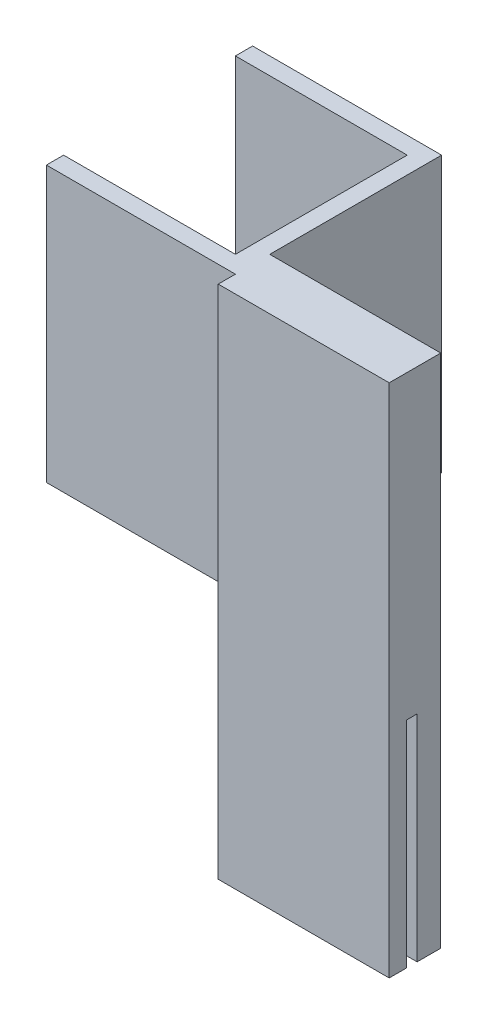
ISO-10303-21;
HEADER;
FILE_DESCRIPTION(('STEP AP214'),'2;1');
FILE_NAME('part.step','',(''),(''),'','','');
FILE_SCHEMA(('AUTOMOTIVE_DESIGN { 1 0 10303 214 1 1 1 1 }'));
ENDSEC;
DATA;
#1=APPLICATION_CONTEXT('core data for automotive mechanical design processes');
#2=APPLICATION_PROTOCOL_DEFINITION('international standard','automotive_design',2000,#1);
#3=PRODUCT_CONTEXT('',#1,'mechanical');
#4=PRODUCT('Part','Part','',(#3));
#5=PRODUCT_RELATED_PRODUCT_CATEGORY('part','',(#4));
#6=PRODUCT_DEFINITION_FORMATION('','',#4);
#7=PRODUCT_DEFINITION_CONTEXT('part definition',#1,'design');
#8=PRODUCT_DEFINITION('design','',#6,#7);
#9=PRODUCT_DEFINITION_SHAPE('','',#8);
#10=(LENGTH_UNIT() NAMED_UNIT(*) SI_UNIT(.MILLI.,.METRE.));
#11=(NAMED_UNIT(*) PLANE_ANGLE_UNIT() SI_UNIT($,.RADIAN.));
#12=(NAMED_UNIT(*) SI_UNIT($,.STERADIAN.) SOLID_ANGLE_UNIT());
#13=UNCERTAINTY_MEASURE_WITH_UNIT(LENGTH_MEASURE(1.E-05),#10,'distance_accuracy_value','');
#14=(GEOMETRIC_REPRESENTATION_CONTEXT(3) GLOBAL_UNCERTAINTY_ASSIGNED_CONTEXT((#13)) GLOBAL_UNIT_ASSIGNED_CONTEXT((#10,
#11,#12)) REPRESENTATION_CONTEXT('',''));
#15=CARTESIAN_POINT('',(0.,0.,0.));
#16=DIRECTION('',(0.,0.,1.));
#17=DIRECTION('',(1.,0.,0.));
#18=AXIS2_PLACEMENT_3D('',#15,#16,#17);
#19=CARTESIAN_POINT('',(2.54,-35.56,-2.54));
#20=DIRECTION('',(0.,-1.,0.));
#21=DIRECTION('',(0.,0.,-1.));
#22=AXIS2_PLACEMENT_3D('',#19,#20,#21);
#23=PLANE('',#22);
#24=DIRECTION('',(-1.,0.,0.));
#25=VECTOR('',#24,1.);
#26=CARTESIAN_POINT('',(2.54,-35.56,2.54));
#27=LINE('',#26,#25);
#28=CARTESIAN_POINT('',(27.8143993573679,-35.56,2.54));
#29=VERTEX_POINT('',#28);
#30=CARTESIAN_POINT('',(2.54,-35.56,2.54));
#31=VERTEX_POINT('',#30);
#32=EDGE_CURVE('E178',#29,#31,#27,.T.);
#33=ORIENTED_EDGE('',*,*,#32,.F.);
#34=DIRECTION('',(0.,0.,1.));
#35=VECTOR('',#34,1.);
#36=CARTESIAN_POINT('',(27.8143993573679,-35.56,-2.54));
#37=LINE('',#36,#35);
#38=CARTESIAN_POINT('',(27.8143993573679,-35.56,5.08));
#39=VERTEX_POINT('',#38);
#40=EDGE_CURVE('E238',#29,#39,#37,.T.);
#41=ORIENTED_EDGE('',*,*,#40,.T.);
#42=DIRECTION('',(1.,0.,0.));
#43=VECTOR('',#42,1.);
#44=CARTESIAN_POINT('',(2.54,-35.56,5.08));
#45=LINE('',#44,#43);
#46=CARTESIAN_POINT('',(2.54,-35.56,5.08));
#47=VERTEX_POINT('',#46);
#48=EDGE_CURVE('E197',#47,#39,#45,.T.);
#49=ORIENTED_EDGE('',*,*,#48,.F.);
#50=DIRECTION('',(0.,0.,1.));
#51=VECTOR('',#50,1.);
#52=CARTESIAN_POINT('',(2.54,-35.56,-2.54));
#53=LINE('',#52,#51);
#54=EDGE_CURVE('E226',#31,#47,#53,.T.);
#55=ORIENTED_EDGE('',*,*,#54,.F.);
#56=EDGE_LOOP('',(#33,#41,#49,#55));
#57=FACE_BOUND('',#56,.T.);
#58=ADVANCED_FACE('F45',(#57),#23,.T.);
#59=CARTESIAN_POINT('',(0.,40.64,-27.94));
#60=DIRECTION('',(0.,0.,1.));
#61=DIRECTION('',(1.,0.,0.));
#62=AXIS2_PLACEMENT_3D('',#59,#60,#61);
#63=PLANE('',#62);
#64=DIRECTION('',(1.,0.,0.));
#65=VECTOR('',#64,1.);
#66=CARTESIAN_POINT('',(0.,0.,-27.94));
#67=LINE('',#66,#65);
#68=CARTESIAN_POINT('',(2.54,0.,-27.94));
#69=VERTEX_POINT('',#68);
#70=CARTESIAN_POINT('',(-25.4,0.,-27.94));
#71=VERTEX_POINT('',#70);
#72=EDGE_CURVE('E230',#69,#71,#67,.F.);
#73=ORIENTED_EDGE('',*,*,#72,.T.);
#74=DIRECTION('',(0.,-1.,0.));
#75=VECTOR('',#74,1.);
#76=CARTESIAN_POINT('',(-25.4,40.64,-27.94));
#77=LINE('',#76,#75);
#78=CARTESIAN_POINT('',(-25.4,40.64,-27.94));
#79=VERTEX_POINT('',#78);
#80=EDGE_CURVE('E11',#79,#71,#77,.T.);
#81=ORIENTED_EDGE('',*,*,#80,.F.);
#82=DIRECTION('',(1.,0.,0.));
#83=VECTOR('',#82,1.);
#84=CARTESIAN_POINT('',(0.,40.64,-27.94));
#85=LINE('',#84,#83);
#86=CARTESIAN_POINT('',(2.54,40.64,-27.94));
#87=VERTEX_POINT('',#86);
#88=EDGE_CURVE('E241',#87,#79,#85,.F.);
#89=ORIENTED_EDGE('',*,*,#88,.F.);
#90=DIRECTION('',(0.,-1.,0.));
#91=VECTOR('',#90,1.);
#92=CARTESIAN_POINT('',(2.54,40.64,-27.94));
#93=LINE('',#92,#91);
#94=EDGE_CURVE('E272',#87,#69,#93,.T.);
#95=ORIENTED_EDGE('',*,*,#94,.T.);
#96=EDGE_LOOP('',(#73,#81,#89,#95));
#97=FACE_BOUND('',#96,.T.);
#98=ADVANCED_FACE('F47',(#97),#63,.F.);
#99=CARTESIAN_POINT('',(-25.4,40.64,-25.4));
#100=DIRECTION('',(-1.,0.,0.));
#101=DIRECTION('',(0.,0.,1.));
#102=AXIS2_PLACEMENT_3D('',#99,#100,#101);
#103=PLANE('',#102);
#104=DIRECTION('',(0.,0.,-1.));
#105=VECTOR('',#104,1.);
#106=CARTESIAN_POINT('',(-25.4,0.,-25.4));
#107=LINE('',#106,#105);
#108=CARTESIAN_POINT('',(-25.4,0.,-25.4));
#109=VERTEX_POINT('',#108);
#110=EDGE_CURVE('E276',#109,#71,#107,.T.);
#111=ORIENTED_EDGE('',*,*,#110,.F.);
#112=DIRECTION('',(0.,-1.,0.));
#113=VECTOR('',#112,1.);
#114=CARTESIAN_POINT('',(-25.4,40.64,-25.4));
#115=LINE('',#114,#113);
#116=CARTESIAN_POINT('',(-25.4,40.64,-25.4));
#117=VERTEX_POINT('',#116);
#118=EDGE_CURVE('E54',#117,#109,#115,.T.);
#119=ORIENTED_EDGE('',*,*,#118,.F.);
#120=DIRECTION('',(0.,0.,-1.));
#121=VECTOR('',#120,1.);
#122=CARTESIAN_POINT('',(-25.4,40.64,-25.4));
#123=LINE('',#122,#121);
#124=EDGE_CURVE('E244',#117,#79,#123,.T.);
#125=ORIENTED_EDGE('',*,*,#124,.T.);
#126=ORIENTED_EDGE('',*,*,#80,.T.);
#127=EDGE_LOOP('',(#111,#119,#125,#126));
#128=FACE_BOUND('',#127,.T.);
#129=ADVANCED_FACE('F328',(#128),#103,.T.);
#130=CARTESIAN_POINT('',(0.,40.64,-25.4));
#131=DIRECTION('',(0.,0.,1.));
#132=DIRECTION('',(1.,0.,0.));
#133=AXIS2_PLACEMENT_3D('',#130,#131,#132);
#134=PLANE('',#133);
#135=DIRECTION('',(-1.,0.,0.));
#136=VECTOR('',#135,1.);
#137=CARTESIAN_POINT('',(0.,0.,-25.4));
#138=LINE('',#137,#136);
#139=CARTESIAN_POINT('',(0.,0.,-25.4));
#140=VERTEX_POINT('',#139);
#141=EDGE_CURVE('E280',#140,#109,#138,.T.);
#142=ORIENTED_EDGE('',*,*,#141,.F.);
#143=DIRECTION('',(0.,-1.,0.));
#144=VECTOR('',#143,1.);
#145=CARTESIAN_POINT('',(0.,40.64,-25.4));
#146=LINE('',#145,#144);
#147=CARTESIAN_POINT('',(0.,40.64,-25.4));
#148=VERTEX_POINT('',#147);
#149=EDGE_CURVE('E318',#148,#140,#146,.T.);
#150=ORIENTED_EDGE('',*,*,#149,.F.);
#151=DIRECTION('',(-1.,0.,0.));
#152=VECTOR('',#151,1.);
#153=CARTESIAN_POINT('',(0.,40.64,-25.4));
#154=LINE('',#153,#152);
#155=EDGE_CURVE('E249',#148,#117,#154,.T.);
#156=ORIENTED_EDGE('',*,*,#155,.T.);
#157=ORIENTED_EDGE('',*,*,#118,.T.);
#158=EDGE_LOOP('',(#142,#150,#156,#157));
#159=FACE_BOUND('',#158,.T.);
#160=ADVANCED_FACE('F324',(#159),#134,.T.);
#161=CARTESIAN_POINT('',(0.,40.64,0.));
#162=DIRECTION('',(-1.,0.,0.));
#163=DIRECTION('',(0.,0.,1.));
#164=AXIS2_PLACEMENT_3D('',#161,#162,#163);
#165=PLANE('',#164);
#166=DIRECTION('',(0.,0.,-1.));
#167=VECTOR('',#166,1.);
#168=CARTESIAN_POINT('',(0.,0.,0.));
#169=LINE('',#168,#167);
#170=CARTESIAN_POINT('',(0.,0.,0.));
#171=VERTEX_POINT('',#170);
#172=EDGE_CURVE('E284',#171,#140,#169,.T.);
#173=ORIENTED_EDGE('',*,*,#172,.F.);
#174=DIRECTION('',(0.,-1.,0.));
#175=VECTOR('',#174,1.);
#176=CARTESIAN_POINT('',(0.,40.64,0.));
#177=LINE('',#176,#175);
#178=CARTESIAN_POINT('',(0.,40.64,0.));
#179=VERTEX_POINT('',#178);
#180=EDGE_CURVE('E315',#179,#171,#177,.T.);
#181=ORIENTED_EDGE('',*,*,#180,.F.);
#182=DIRECTION('',(0.,0.,-1.));
#183=VECTOR('',#182,1.);
#184=CARTESIAN_POINT('',(0.,40.64,0.));
#185=LINE('',#184,#183);
#186=EDGE_CURVE('E253',#179,#148,#185,.T.);
#187=ORIENTED_EDGE('',*,*,#186,.T.);
#188=ORIENTED_EDGE('',*,*,#149,.T.);
#189=EDGE_LOOP('',(#173,#181,#187,#188));
#190=FACE_BOUND('',#189,.T.);
#191=ADVANCED_FACE('F336',(#190),#165,.T.);
#192=CARTESIAN_POINT('',(0.,40.64,0.));
#193=DIRECTION('',(0.,0.,-1.));
#194=DIRECTION('',(-1.,0.,0.));
#195=AXIS2_PLACEMENT_3D('',#192,#193,#194);
#196=PLANE('',#195);
#197=DIRECTION('',(1.,0.,0.));
#198=VECTOR('',#197,1.);
#199=CARTESIAN_POINT('',(0.,0.,0.));
#200=LINE('',#199,#198);
#201=CARTESIAN_POINT('',(-25.4,0.,0.));
#202=VERTEX_POINT('',#201);
#203=EDGE_CURVE('E288',#202,#171,#200,.T.);
#204=ORIENTED_EDGE('',*,*,#203,.F.);
#205=DIRECTION('',(0.,-1.,0.));
#206=VECTOR('',#205,1.);
#207=CARTESIAN_POINT('',(-25.4,40.64,0.));
#208=LINE('',#207,#206);
#209=CARTESIAN_POINT('',(-25.4,40.64,0.));
#210=VERTEX_POINT('',#209);
#211=EDGE_CURVE('E312',#210,#202,#208,.T.);
#212=ORIENTED_EDGE('',*,*,#211,.F.);
#213=DIRECTION('',(1.,0.,0.));
#214=VECTOR('',#213,1.);
#215=CARTESIAN_POINT('',(0.,40.64,0.));
#216=LINE('',#215,#214);
#217=EDGE_CURVE('E257',#210,#179,#216,.T.);
#218=ORIENTED_EDGE('',*,*,#217,.T.);
#219=ORIENTED_EDGE('',*,*,#180,.T.);
#220=EDGE_LOOP('',(#204,#212,#218,#219));
#221=FACE_BOUND('',#220,.T.);
#222=ADVANCED_FACE('F387',(#221),#196,.T.);
#223=CARTESIAN_POINT('',(-25.4,40.64,2.54));
#224=DIRECTION('',(-1.,0.,0.));
#225=DIRECTION('',(0.,0.,1.));
#226=AXIS2_PLACEMENT_3D('',#223,#224,#225);
#227=PLANE('',#226);
#228=DIRECTION('',(0.,0.,-1.));
#229=VECTOR('',#228,1.);
#230=CARTESIAN_POINT('',(-25.4,0.,2.54));
#231=LINE('',#230,#229);
#232=CARTESIAN_POINT('',(-25.4,0.,2.54));
#233=VERTEX_POINT('',#232);
#234=EDGE_CURVE('E292',#233,#202,#231,.T.);
#235=ORIENTED_EDGE('',*,*,#234,.F.);
#236=DIRECTION('',(0.,-1.,0.));
#237=VECTOR('',#236,1.);
#238=CARTESIAN_POINT('',(-25.4,40.64,2.54));
#239=LINE('',#238,#237);
#240=CARTESIAN_POINT('',(-25.4,40.64,2.54));
#241=VERTEX_POINT('',#240);
#242=EDGE_CURVE('E309',#241,#233,#239,.T.);
#243=ORIENTED_EDGE('',*,*,#242,.F.);
#244=DIRECTION('',(0.,0.,-1.));
#245=VECTOR('',#244,1.);
#246=CARTESIAN_POINT('',(-25.4,40.64,2.54));
#247=LINE('',#246,#245);
#248=EDGE_CURVE('E261',#241,#210,#247,.T.);
#249=ORIENTED_EDGE('',*,*,#248,.T.);
#250=ORIENTED_EDGE('',*,*,#211,.T.);
#251=EDGE_LOOP('',(#235,#243,#249,#250));
#252=FACE_BOUND('',#251,.T.);
#253=ADVANCED_FACE('F385',(#252),#227,.T.);
#254=CARTESIAN_POINT('',(0.,40.64,2.54));
#255=DIRECTION('',(0.,0.,-1.));
#256=DIRECTION('',(-1.,0.,0.));
#257=AXIS2_PLACEMENT_3D('',#254,#255,#256);
#258=PLANE('',#257);
#259=DIRECTION('',(1.,0.,0.));
#260=VECTOR('',#259,1.);
#261=CARTESIAN_POINT('',(0.,0.,2.54));
#262=LINE('',#261,#260);
#263=CARTESIAN_POINT('',(2.54,0.,2.54));
#264=VERTEX_POINT('',#263);
#265=EDGE_CURVE('E296',#233,#264,#262,.T.);
#266=ORIENTED_EDGE('',*,*,#265,.T.);
#267=DIRECTION('',(0.,-1.,0.));
#268=VECTOR('',#267,1.);
#269=CARTESIAN_POINT('',(2.54,40.64,2.54));
#270=LINE('',#269,#268);
#271=CARTESIAN_POINT('',(2.54,40.64,2.54));
#272=VERTEX_POINT('',#271);
#273=EDGE_CURVE('E306',#272,#264,#270,.T.);
#274=ORIENTED_EDGE('',*,*,#273,.F.);
#275=DIRECTION('',(1.,0.,0.));
#276=VECTOR('',#275,1.);
#277=CARTESIAN_POINT('',(0.,40.64,2.54));
#278=LINE('',#277,#276);
#279=EDGE_CURVE('E265',#241,#272,#278,.T.);
#280=ORIENTED_EDGE('',*,*,#279,.F.);
#281=ORIENTED_EDGE('',*,*,#242,.T.);
#282=EDGE_LOOP('',(#266,#274,#280,#281));
#283=FACE_BOUND('',#282,.T.);
#284=ADVANCED_FACE('F382',(#283),#258,.F.);
#285=CARTESIAN_POINT('',(2.54,40.64,0.));
#286=DIRECTION('',(-1.,0.,0.));
#287=DIRECTION('',(0.,0.,1.));
#288=AXIS2_PLACEMENT_3D('',#285,#286,#287);
#289=PLANE('',#288);
#290=DIRECTION('',(0.,0.,-1.));
#291=VECTOR('',#290,1.);
#292=CARTESIAN_POINT('',(2.54,40.64,0.));
#293=LINE('',#292,#291);
#294=CARTESIAN_POINT('',(2.54,40.64,-2.54));
#295=VERTEX_POINT('',#294);
#296=EDGE_CURVE('E269',#295,#87,#293,.T.);
#297=ORIENTED_EDGE('',*,*,#296,.F.);
#298=DIRECTION('',(0.,-1.,0.));
#299=VECTOR('',#298,1.);
#300=CARTESIAN_POINT('',(2.54,-35.56,-2.54));
#301=LINE('',#300,#299);
#302=CARTESIAN_POINT('',(2.54,0.,-2.54));
#303=VERTEX_POINT('',#302);
#304=EDGE_CURVE('E210',#295,#303,#301,.T.);
#305=ORIENTED_EDGE('',*,*,#304,.T.);
#306=DIRECTION('',(0.,0.,-1.));
#307=VECTOR('',#306,1.);
#308=CARTESIAN_POINT('',(2.54,0.,0.));
#309=LINE('',#308,#307);
#310=EDGE_CURVE('E300',#303,#69,#309,.T.);
#311=ORIENTED_EDGE('',*,*,#310,.T.);
#312=ORIENTED_EDGE('',*,*,#94,.F.);
#313=EDGE_LOOP('',(#297,#305,#311,#312));
#314=FACE_BOUND('',#313,.T.);
#315=ADVANCED_FACE('F417',(#314),#289,.F.);
#316=CARTESIAN_POINT('',(0.,40.64,0.));
#317=DIRECTION('',(0.,1.,0.));
#318=DIRECTION('',(1.,0.,0.));
#319=AXIS2_PLACEMENT_3D('',#316,#317,#318);
#320=PLANE('',#319);
#321=ORIENTED_EDGE('',*,*,#88,.T.);
#322=ORIENTED_EDGE('',*,*,#124,.F.);
#323=ORIENTED_EDGE('',*,*,#155,.F.);
#324=ORIENTED_EDGE('',*,*,#186,.F.);
#325=ORIENTED_EDGE('',*,*,#217,.F.);
#326=ORIENTED_EDGE('',*,*,#248,.F.);
#327=ORIENTED_EDGE('',*,*,#279,.T.);
#328=DIRECTION('',(0.,0.,1.));
#329=VECTOR('',#328,1.);
#330=CARTESIAN_POINT('',(2.54,40.64,-2.54));
#331=LINE('',#330,#329);
#332=CARTESIAN_POINT('',(2.54,40.64,5.08));
#333=VERTEX_POINT('',#332);
#334=EDGE_CURVE('E227',#272,#333,#331,.T.);
#335=ORIENTED_EDGE('',*,*,#334,.T.);
#336=DIRECTION('',(-1.,0.,0.));
#337=VECTOR('',#336,1.);
#338=CARTESIAN_POINT('',(2.54,40.64,5.08));
#339=LINE('',#338,#337);
#340=CARTESIAN_POINT('',(27.8143993573678,40.64,5.08));
#341=VERTEX_POINT('',#340);
#342=EDGE_CURVE('E206',#341,#333,#339,.T.);
#343=ORIENTED_EDGE('',*,*,#342,.F.);
#344=DIRECTION('',(0.,0.,1.));
#345=VECTOR('',#344,1.);
#346=CARTESIAN_POINT('',(27.8143993573678,40.64,-2.54));
#347=LINE('',#346,#345);
#348=CARTESIAN_POINT('',(27.8143993573678,40.64,-2.54));
#349=VERTEX_POINT('',#348);
#350=EDGE_CURVE('E231',#349,#341,#347,.T.);
#351=ORIENTED_EDGE('',*,*,#350,.F.);
#352=DIRECTION('',(-1.,0.,0.));
#353=VECTOR('',#352,1.);
#354=CARTESIAN_POINT('',(2.54,40.64,-2.54));
#355=LINE('',#354,#353);
#356=EDGE_CURVE('E222',#349,#295,#355,.T.);
#357=ORIENTED_EDGE('',*,*,#356,.T.);
#358=ORIENTED_EDGE('',*,*,#296,.T.);
#359=EDGE_LOOP('',(#321,#322,#323,#324,#325,#326,#327,#335,#343,#351,#357,#358));
#360=FACE_BOUND('',#359,.T.);
#361=ADVANCED_FACE('F339',(#360),#320,.T.);
#362=CARTESIAN_POINT('',(0.,0.,0.));
#363=DIRECTION('',(0.,1.,0.));
#364=DIRECTION('',(1.,0.,0.));
#365=AXIS2_PLACEMENT_3D('',#362,#363,#364);
#366=PLANE('',#365);
#367=ORIENTED_EDGE('',*,*,#72,.F.);
#368=ORIENTED_EDGE('',*,*,#310,.F.);
#369=EDGE_CURVE('E245',#264,#303,#309,.T.);
#370=ORIENTED_EDGE('',*,*,#369,.F.);
#371=ORIENTED_EDGE('',*,*,#265,.F.);
#372=ORIENTED_EDGE('',*,*,#234,.T.);
#373=ORIENTED_EDGE('',*,*,#203,.T.);
#374=ORIENTED_EDGE('',*,*,#172,.T.);
#375=ORIENTED_EDGE('',*,*,#141,.T.);
#376=ORIENTED_EDGE('',*,*,#110,.T.);
#377=EDGE_LOOP('',(#367,#368,#370,#371,#372,#373,#374,#375,#376));
#378=FACE_BOUND('',#377,.T.);
#379=ADVANCED_FACE('F332',(#378),#366,.F.);
#380=CARTESIAN_POINT('',(2.54,-35.56,-2.54));
#381=DIRECTION('',(-1.,0.,0.));
#382=DIRECTION('',(0.,0.,1.));
#383=AXIS2_PLACEMENT_3D('',#380,#381,#382);
#384=PLANE('',#383);
#385=DIRECTION('',(0.,-1.,0.));
#386=VECTOR('',#385,1.);
#387=CARTESIAN_POINT('',(2.54,-3.81,2.54));
#388=LINE('',#387,#386);
#389=CARTESIAN_POINT('',(2.54,-3.81,2.54));
#390=VERTEX_POINT('',#389);
#391=EDGE_CURVE('E198',#390,#31,#388,.T.);
#392=ORIENTED_EDGE('',*,*,#391,.T.);
#393=ORIENTED_EDGE('',*,*,#54,.T.);
#394=DIRECTION('',(0.,-1.,0.));
#395=VECTOR('',#394,1.);
#396=CARTESIAN_POINT('',(2.54,-35.56,5.08));
#397=LINE('',#396,#395);
#398=EDGE_CURVE('E193',#333,#47,#397,.T.);
#399=ORIENTED_EDGE('',*,*,#398,.F.);
#400=ORIENTED_EDGE('',*,*,#334,.F.);
#401=ORIENTED_EDGE('',*,*,#273,.T.);
#402=ORIENTED_EDGE('',*,*,#369,.T.);
#403=CARTESIAN_POINT('',(2.54,-35.56,-2.54));
#404=VERTEX_POINT('',#403);
#405=EDGE_CURVE('E69',#303,#404,#301,.T.);
#406=ORIENTED_EDGE('',*,*,#405,.T.);
#407=CARTESIAN_POINT('',(2.54,-35.56,0.952856607384716));
#408=VERTEX_POINT('',#407);
#409=EDGE_CURVE('E183',#404,#408,#53,.T.);
#410=ORIENTED_EDGE('',*,*,#409,.T.);
#411=DIRECTION('',(0.,-1.,0.));
#412=VECTOR('',#411,1.);
#413=CARTESIAN_POINT('',(2.54,-3.81,0.952856607384716));
#414=LINE('',#413,#412);
#415=CARTESIAN_POINT('',(2.54,-3.81,0.952856607384716));
#416=VERTEX_POINT('',#415);
#417=EDGE_CURVE('E61',#416,#408,#414,.T.);
#418=ORIENTED_EDGE('',*,*,#417,.F.);
#419=DIRECTION('',(0.,0.,-1.));
#420=VECTOR('',#419,1.);
#421=CARTESIAN_POINT('',(2.54,-3.81,0.952856607384716));
#422=LINE('',#421,#420);
#423=EDGE_CURVE('E168',#390,#416,#422,.T.);
#424=ORIENTED_EDGE('',*,*,#423,.F.);
#425=EDGE_LOOP('',(#392,#393,#399,#400,#401,#402,#406,#410,#418,#424));
#426=FACE_BOUND('',#425,.T.);
#427=ADVANCED_FACE('F181',(#426),#384,.T.);
#428=CARTESIAN_POINT('',(27.8143993573678,40.64,-2.54));
#429=DIRECTION('',(1.,0.,0.));
#430=DIRECTION('',(0.,1.,0.));
#431=AXIS2_PLACEMENT_3D('',#428,#429,#430);
#432=PLANE('',#431);
#433=DIRECTION('',(0.,-1.,0.));
#434=VECTOR('',#433,1.);
#435=CARTESIAN_POINT('',(27.8143993573679,-3.81,2.54));
#436=LINE('',#435,#434);
#437=CARTESIAN_POINT('',(27.8143993573679,-3.81,2.54));
#438=VERTEX_POINT('',#437);
#439=EDGE_CURVE('E188',#438,#29,#436,.T.);
#440=ORIENTED_EDGE('',*,*,#439,.F.);
#441=DIRECTION('',(0.,0.,1.));
#442=VECTOR('',#441,1.);
#443=CARTESIAN_POINT('',(27.8143993573679,-3.81,2.54));
#444=LINE('',#443,#442);
#445=CARTESIAN_POINT('',(27.8143993573679,-3.81,0.952856607384716));
#446=VERTEX_POINT('',#445);
#447=EDGE_CURVE('E167',#446,#438,#444,.T.);
#448=ORIENTED_EDGE('',*,*,#447,.F.);
#449=DIRECTION('',(0.,-1.,0.));
#450=VECTOR('',#449,1.);
#451=CARTESIAN_POINT('',(27.8143993573679,-3.81,0.952856607384716));
#452=LINE('',#451,#450);
#453=CARTESIAN_POINT('',(27.8143993573679,-35.56,0.952856607384716));
#454=VERTEX_POINT('',#453);
#455=EDGE_CURVE('E163',#446,#454,#452,.T.);
#456=ORIENTED_EDGE('',*,*,#455,.T.);
#457=CARTESIAN_POINT('',(27.8143993573679,-35.56,-2.54));
#458=VERTEX_POINT('',#457);
#459=EDGE_CURVE('E234',#458,#454,#37,.T.);
#460=ORIENTED_EDGE('',*,*,#459,.F.);
#461=DIRECTION('',(0.,1.,0.));
#462=VECTOR('',#461,1.);
#463=CARTESIAN_POINT('',(27.8143993573678,40.64,-2.54));
#464=LINE('',#463,#462);
#465=EDGE_CURVE('E218',#458,#349,#464,.T.);
#466=ORIENTED_EDGE('',*,*,#465,.T.);
#467=ORIENTED_EDGE('',*,*,#350,.T.);
#468=DIRECTION('',(0.,1.,0.));
#469=VECTOR('',#468,1.);
#470=CARTESIAN_POINT('',(27.8143993573678,40.64,5.08));
#471=LINE('',#470,#469);
#472=EDGE_CURVE('E202',#39,#341,#471,.T.);
#473=ORIENTED_EDGE('',*,*,#472,.F.);
#474=ORIENTED_EDGE('',*,*,#40,.F.);
#475=EDGE_LOOP('',(#440,#448,#456,#460,#466,#467,#473,#474));
#476=FACE_BOUND('',#475,.T.);
#477=ADVANCED_FACE('F369',(#476),#432,.T.);
#478=DIRECTION('',(1.,0.,0.));
#479=VECTOR('',#478,1.);
#480=CARTESIAN_POINT('',(27.8143993573679,-35.56,0.952856607384716));
#481=LINE('',#480,#479);
#482=EDGE_CURVE('E362',#408,#454,#481,.T.);
#483=ORIENTED_EDGE('',*,*,#482,.F.);
#484=ORIENTED_EDGE('',*,*,#409,.F.);
#485=DIRECTION('',(1.,0.,0.));
#486=VECTOR('',#485,1.);
#487=CARTESIAN_POINT('',(2.54,-35.56,-2.54));
#488=LINE('',#487,#486);
#489=EDGE_CURVE('E214',#404,#458,#488,.T.);
#490=ORIENTED_EDGE('',*,*,#489,.T.);
#491=ORIENTED_EDGE('',*,*,#459,.T.);
#492=EDGE_LOOP('',(#483,#484,#490,#491));
#493=FACE_BOUND('',#492,.T.);
#494=ADVANCED_FACE('F398',(#493),#23,.T.);
#495=CARTESIAN_POINT('',(0.,0.,-2.54));
#496=DIRECTION('',(0.,0.,-1.));
#497=DIRECTION('',(-1.,0.,0.));
#498=AXIS2_PLACEMENT_3D('',#495,#496,#497);
#499=PLANE('',#498);
#500=ORIENTED_EDGE('',*,*,#304,.F.);
#501=ORIENTED_EDGE('',*,*,#356,.F.);
#502=ORIENTED_EDGE('',*,*,#465,.F.);
#503=ORIENTED_EDGE('',*,*,#489,.F.);
#504=ORIENTED_EDGE('',*,*,#405,.F.);
#505=EDGE_LOOP('',(#500,#501,#502,#503,#504));
#506=FACE_BOUND('',#505,.T.);
#507=ADVANCED_FACE('F407',(#506),#499,.T.);
#508=CARTESIAN_POINT('',(0.,0.,5.08));
#509=DIRECTION('',(0.,0.,-1.));
#510=DIRECTION('',(-1.,0.,0.));
#511=AXIS2_PLACEMENT_3D('',#508,#509,#510);
#512=PLANE('',#511);
#513=ORIENTED_EDGE('',*,*,#398,.T.);
#514=ORIENTED_EDGE('',*,*,#48,.T.);
#515=ORIENTED_EDGE('',*,*,#472,.T.);
#516=ORIENTED_EDGE('',*,*,#342,.T.);
#517=EDGE_LOOP('',(#513,#514,#515,#516));
#518=FACE_BOUND('',#517,.T.);
#519=ADVANCED_FACE('F375',(#518),#512,.F.);
#520=CARTESIAN_POINT('',(2.54,-3.81,2.54));
#521=DIRECTION('',(0.,0.,1.));
#522=DIRECTION('',(1.,0.,0.));
#523=AXIS2_PLACEMENT_3D('',#520,#521,#522);
#524=PLANE('',#523);
#525=ORIENTED_EDGE('',*,*,#32,.T.);
#526=ORIENTED_EDGE('',*,*,#391,.F.);
#527=DIRECTION('',(-1.,0.,0.));
#528=VECTOR('',#527,1.);
#529=CARTESIAN_POINT('',(2.54,-3.81,2.54));
#530=LINE('',#529,#528);
#531=EDGE_CURVE('E174',#438,#390,#530,.T.);
#532=ORIENTED_EDGE('',*,*,#531,.F.);
#533=ORIENTED_EDGE('',*,*,#439,.T.);
#534=EDGE_LOOP('',(#525,#526,#532,#533));
#535=FACE_BOUND('',#534,.T.);
#536=ADVANCED_FACE('F367',(#535),#524,.F.);
#537=CARTESIAN_POINT('',(27.8143993573679,-3.81,0.952856607384716));
#538=DIRECTION('',(0.,0.,-1.));
#539=DIRECTION('',(-1.,0.,0.));
#540=AXIS2_PLACEMENT_3D('',#537,#538,#539);
#541=PLANE('',#540);
#542=ORIENTED_EDGE('',*,*,#482,.T.);
#543=ORIENTED_EDGE('',*,*,#455,.F.);
#544=DIRECTION('',(1.,0.,0.));
#545=VECTOR('',#544,1.);
#546=CARTESIAN_POINT('',(27.8143993573679,-3.81,0.952856607384716));
#547=LINE('',#546,#545);
#548=EDGE_CURVE('E159',#416,#446,#547,.T.);
#549=ORIENTED_EDGE('',*,*,#548,.F.);
#550=ORIENTED_EDGE('',*,*,#417,.T.);
#551=EDGE_LOOP('',(#542,#543,#549,#550));
#552=FACE_BOUND('',#551,.T.);
#553=ADVANCED_FACE('F161',(#552),#541,.F.);
#554=CARTESIAN_POINT('',(0.,-3.81,0.));
#555=DIRECTION('',(0.,1.,0.));
#556=DIRECTION('',(0.,0.,1.));
#557=AXIS2_PLACEMENT_3D('',#554,#555,#556);
#558=PLANE('',#557);
#559=ORIENTED_EDGE('',*,*,#423,.T.);
#560=ORIENTED_EDGE('',*,*,#548,.T.);
#561=ORIENTED_EDGE('',*,*,#447,.T.);
#562=ORIENTED_EDGE('',*,*,#531,.T.);
#563=EDGE_LOOP('',(#559,#560,#561,#562));
#564=FACE_BOUND('',#563,.T.);
#565=ADVANCED_FACE('F172',(#564),#558,.F.);
#566=CLOSED_SHELL('',(#58,#98,#129,#160,#191,#222,#253,#284,#315,#361,#379,#427,#477,#494,#507,
#519,#536,#553,#565));
#567=MANIFOLD_SOLID_BREP('B2',#566);
#568=ADVANCED_BREP_SHAPE_REPRESENTATION('',(#18,#567),#14);
#569=SHAPE_DEFINITION_REPRESENTATION(#9,#568);
ENDSEC;
END-ISO-10303-21;
